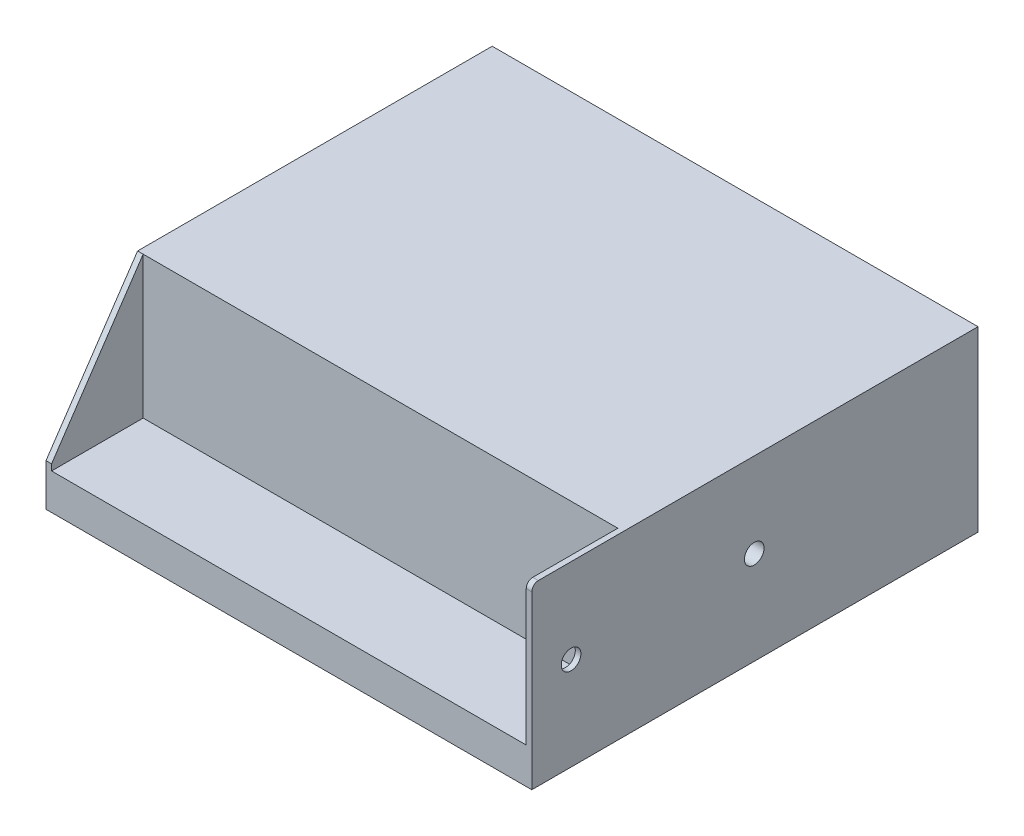
ISO-10303-21;
HEADER;
FILE_DESCRIPTION(('STEP AP214'),'2;1');
FILE_NAME('part.step','',(''),(''),'','','');
FILE_SCHEMA(('AUTOMOTIVE_DESIGN { 1 0 10303 214 1 1 1 1 }'));
ENDSEC;
DATA;
#1=APPLICATION_CONTEXT('core data for automotive mechanical design processes');
#2=APPLICATION_PROTOCOL_DEFINITION('international standard','automotive_design',2000,#1);
#3=PRODUCT_CONTEXT('',#1,'mechanical');
#4=PRODUCT('Part','Part','',(#3));
#5=PRODUCT_RELATED_PRODUCT_CATEGORY('part','',(#4));
#6=PRODUCT_DEFINITION_FORMATION('','',#4);
#7=PRODUCT_DEFINITION_CONTEXT('part definition',#1,'design');
#8=PRODUCT_DEFINITION('design','',#6,#7);
#9=PRODUCT_DEFINITION_SHAPE('','',#8);
#10=(LENGTH_UNIT() NAMED_UNIT(*) SI_UNIT(.MILLI.,.METRE.));
#11=(NAMED_UNIT(*) PLANE_ANGLE_UNIT() SI_UNIT($,.RADIAN.));
#12=(NAMED_UNIT(*) SI_UNIT($,.STERADIAN.) SOLID_ANGLE_UNIT());
#13=UNCERTAINTY_MEASURE_WITH_UNIT(LENGTH_MEASURE(1.E-05),#10,'distance_accuracy_value','');
#14=(GEOMETRIC_REPRESENTATION_CONTEXT(3) GLOBAL_UNCERTAINTY_ASSIGNED_CONTEXT((#13)) GLOBAL_UNIT_ASSIGNED_CONTEXT((#10,
#11,#12)) REPRESENTATION_CONTEXT('',''));
#15=CARTESIAN_POINT('',(0.,0.,0.));
#16=DIRECTION('',(0.,0.,1.));
#17=DIRECTION('',(1.,0.,0.));
#18=AXIS2_PLACEMENT_3D('',#15,#16,#17);
#19=CARTESIAN_POINT('',(-37.125,27.2,34.1));
#20=DIRECTION('',(1.,0.,0.));
#21=DIRECTION('',(0.,0.,-1.));
#22=AXIS2_PLACEMENT_3D('',#19,#20,#21);
#23=PLANE('',#22);
#24=DIRECTION('',(0.,-1.,0.));
#25=VECTOR('',#24,1.);
#26=CARTESIAN_POINT('',(-37.125,27.2,34.1));
#27=LINE('',#26,#25);
#28=CARTESIAN_POINT('',(-37.125,6.44414644082164,34.1));
#29=VERTEX_POINT('',#28);
#30=CARTESIAN_POINT('',(-37.125,0.,34.1));
#31=VERTEX_POINT('',#30);
#32=EDGE_CURVE('E134',#29,#31,#27,.T.);
#33=ORIENTED_EDGE('',*,*,#32,.F.);
#34=DIRECTION('',(0.,0.829037572555041,-0.559192903470748));
#35=VECTOR('',#34,1.);
#36=CARTESIAN_POINT('',(-37.125,27.2,20.1));
#37=LINE('',#36,#35);
#38=CARTESIAN_POINT('',(-37.125,27.2,20.1));
#39=VERTEX_POINT('',#38);
#40=EDGE_CURVE('E198',#29,#39,#37,.T.);
#41=ORIENTED_EDGE('',*,*,#40,.T.);
#42=DIRECTION('',(0.,0.,1.));
#43=VECTOR('',#42,1.);
#44=CARTESIAN_POINT('',(-37.125,27.2,34.1));
#45=LINE('',#44,#43);
#46=CARTESIAN_POINT('',(-37.125,27.2,-34.1));
#47=VERTEX_POINT('',#46);
#48=EDGE_CURVE('E133',#47,#39,#45,.T.);
#49=ORIENTED_EDGE('',*,*,#48,.F.);
#50=DIRECTION('',(0.,-1.,0.));
#51=VECTOR('',#50,1.);
#52=CARTESIAN_POINT('',(-37.125,27.2,-34.1));
#53=LINE('',#52,#51);
#54=CARTESIAN_POINT('',(-37.125,0.,-34.1));
#55=VERTEX_POINT('',#54);
#56=EDGE_CURVE('E178',#47,#55,#53,.T.);
#57=ORIENTED_EDGE('',*,*,#56,.T.);
#58=DIRECTION('',(0.,0.,1.));
#59=VECTOR('',#58,1.);
#60=CARTESIAN_POINT('',(-37.125,0.,34.1));
#61=LINE('',#60,#59);
#62=EDGE_CURVE('E165',#55,#31,#61,.T.);
#63=ORIENTED_EDGE('',*,*,#62,.T.);
#64=EDGE_LOOP('',(#33,#41,#49,#57,#63));
#65=FACE_BOUND('',#64,.T.);
#66=ADVANCED_FACE('F41',(#65),#23,.F.);
#67=CARTESIAN_POINT('',(37.125,27.2,34.1));
#68=DIRECTION('',(0.,0.,-1.));
#69=DIRECTION('',(-1.,0.,0.));
#70=AXIS2_PLACEMENT_3D('',#67,#68,#69);
#71=PLANE('',#70);
#72=DIRECTION('',(0.,-1.,0.));
#73=VECTOR('',#72,1.);
#74=CARTESIAN_POINT('',(37.125,27.2,34.1));
#75=LINE('',#74,#73);
#76=CARTESIAN_POINT('',(37.125,26.2,34.1));
#77=VERTEX_POINT('',#76);
#78=CARTESIAN_POINT('',(37.125,0.,34.1));
#79=VERTEX_POINT('',#78);
#80=EDGE_CURVE('E192',#77,#79,#75,.T.);
#81=ORIENTED_EDGE('',*,*,#80,.F.);
#82=DIRECTION('',(1.,0.,0.));
#83=VECTOR('',#82,1.);
#84=CARTESIAN_POINT('',(36.275,26.2,34.1));
#85=LINE('',#84,#83);
#86=CARTESIAN_POINT('',(36.275,26.2,34.1));
#87=VERTEX_POINT('',#86);
#88=EDGE_CURVE('E49',#77,#87,#85,.F.);
#89=ORIENTED_EDGE('',*,*,#88,.T.);
#90=DIRECTION('',(0.,1.,0.));
#91=VECTOR('',#90,1.);
#92=CARTESIAN_POINT('',(36.275,-73.8884463228183,34.1));
#93=LINE('',#92,#91);
#94=CARTESIAN_POINT('',(36.275,5.50000000000001,34.1));
#95=VERTEX_POINT('',#94);
#96=EDGE_CURVE('E155',#95,#87,#93,.T.);
#97=ORIENTED_EDGE('',*,*,#96,.F.);
#98=DIRECTION('',(-1.,0.,0.));
#99=VECTOR('',#98,1.);
#100=CARTESIAN_POINT('',(36.275,5.50000000000001,34.1));
#101=LINE('',#100,#99);
#102=CARTESIAN_POINT('',(-36.275,5.50000000000001,34.1));
#103=VERTEX_POINT('',#102);
#104=EDGE_CURVE('E453',#95,#103,#101,.T.);
#105=ORIENTED_EDGE('',*,*,#104,.T.);
#106=DIRECTION('',(0.,1.,0.));
#107=VECTOR('',#106,1.);
#108=CARTESIAN_POINT('',(-36.275,-73.8884463228183,34.1));
#109=LINE('',#108,#107);
#110=CARTESIAN_POINT('',(-36.275,6.44414644082164,34.1));
#111=VERTEX_POINT('',#110);
#112=EDGE_CURVE('E142',#103,#111,#109,.T.);
#113=ORIENTED_EDGE('',*,*,#112,.T.);
#114=DIRECTION('',(-1.,0.,0.));
#115=VECTOR('',#114,1.);
#116=CARTESIAN_POINT('',(-37.125,6.44414644082164,34.1));
#117=LINE('',#116,#115);
#118=EDGE_CURVE('E119',#111,#29,#117,.T.);
#119=ORIENTED_EDGE('',*,*,#118,.T.);
#120=ORIENTED_EDGE('',*,*,#32,.T.);
#121=DIRECTION('',(1.,0.,0.));
#122=VECTOR('',#121,1.);
#123=CARTESIAN_POINT('',(37.125,0.,34.1));
#124=LINE('',#123,#122);
#125=EDGE_CURVE('E181',#31,#79,#124,.T.);
#126=ORIENTED_EDGE('',*,*,#125,.T.);
#127=EDGE_LOOP('',(#81,#89,#97,#105,#113,#119,#120,#126));
#128=FACE_BOUND('',#127,.T.);
#129=ADVANCED_FACE('F218',(#128),#71,.F.);
#130=CARTESIAN_POINT('',(37.125,27.2,34.1));
#131=DIRECTION('',(-1.,0.,0.));
#132=DIRECTION('',(0.,0.,1.));
#133=AXIS2_PLACEMENT_3D('',#130,#131,#132);
#134=PLANE('',#133);
#135=CARTESIAN_POINT('',(37.125,14.25,28.1));
#136=DIRECTION('',(1.,0.,0.));
#137=DIRECTION('',(0.,0.,-1.));
#138=AXIS2_PLACEMENT_3D('',#135,#136,#137);
#139=CIRCLE('',#138,1.5);
#140=CARTESIAN_POINT('',(37.125,14.25,26.6));
#141=VERTEX_POINT('',#140);
#142=EDGE_CURVE('E162',#141,#141,#139,.T.);
#143=ORIENTED_EDGE('',*,*,#142,.F.);
#144=EDGE_LOOP('',(#143));
#145=FACE_BOUND('',#144,.T.);
#146=CARTESIAN_POINT('',(37.125,14.25,0.099999999999989));
#147=DIRECTION('',(1.,0.,0.));
#148=DIRECTION('',(0.,0.,-1.));
#149=AXIS2_PLACEMENT_3D('',#146,#147,#148);
#150=CIRCLE('',#149,1.5);
#151=CARTESIAN_POINT('',(37.125,14.25,-1.40000000000001));
#152=VERTEX_POINT('',#151);
#153=EDGE_CURVE('E166',#152,#152,#150,.T.);
#154=ORIENTED_EDGE('',*,*,#153,.F.);
#155=EDGE_LOOP('',(#154));
#156=FACE_BOUND('',#155,.T.);
#157=DIRECTION('',(0.,0.,-1.));
#158=VECTOR('',#157,1.);
#159=CARTESIAN_POINT('',(37.125,27.2,34.1));
#160=LINE('',#159,#158);
#161=CARTESIAN_POINT('',(37.125,27.2,33.1));
#162=VERTEX_POINT('',#161);
#163=CARTESIAN_POINT('',(37.125,27.2,-34.1));
#164=VERTEX_POINT('',#163);
#165=EDGE_CURVE('E173',#162,#164,#160,.T.);
#166=ORIENTED_EDGE('',*,*,#165,.F.);
#167=CARTESIAN_POINT('',(37.125,26.2,33.1));
#168=DIRECTION('',(-1.,0.,0.));
#169=DIRECTION('',(0.,0.,1.));
#170=AXIS2_PLACEMENT_3D('',#167,#168,#169);
#171=CIRCLE('',#170,1.);
#172=EDGE_CURVE('E63',#162,#77,#171,.F.);
#173=ORIENTED_EDGE('',*,*,#172,.T.);
#174=ORIENTED_EDGE('',*,*,#80,.T.);
#175=DIRECTION('',(0.,0.,-1.));
#176=VECTOR('',#175,1.);
#177=CARTESIAN_POINT('',(37.125,0.,34.1));
#178=LINE('',#177,#176);
#179=CARTESIAN_POINT('',(37.125,0.,-34.1));
#180=VERTEX_POINT('',#179);
#181=EDGE_CURVE('E184',#79,#180,#178,.T.);
#182=ORIENTED_EDGE('',*,*,#181,.T.);
#183=DIRECTION('',(0.,-1.,0.));
#184=VECTOR('',#183,1.);
#185=CARTESIAN_POINT('',(37.125,27.2,-34.1));
#186=LINE('',#185,#184);
#187=EDGE_CURVE('E189',#164,#180,#186,.T.);
#188=ORIENTED_EDGE('',*,*,#187,.F.);
#189=EDGE_LOOP('',(#166,#173,#174,#182,#188));
#190=FACE_BOUND('',#189,.T.);
#191=ADVANCED_FACE('F207',(#145,#156,#190),#134,.F.);
#192=CARTESIAN_POINT('',(37.125,27.2,-34.1));
#193=DIRECTION('',(0.,0.,1.));
#194=DIRECTION('',(1.,0.,0.));
#195=AXIS2_PLACEMENT_3D('',#192,#193,#194);
#196=PLANE('',#195);
#197=DIRECTION('',(-1.,0.,0.));
#198=VECTOR('',#197,1.);
#199=CARTESIAN_POINT('',(37.125,0.,-34.1));
#200=LINE('',#199,#198);
#201=EDGE_CURVE('E174',#180,#55,#200,.T.);
#202=ORIENTED_EDGE('',*,*,#201,.T.);
#203=ORIENTED_EDGE('',*,*,#56,.F.);
#204=DIRECTION('',(-1.,0.,0.));
#205=VECTOR('',#204,1.);
#206=CARTESIAN_POINT('',(37.125,27.2,-34.1));
#207=LINE('',#206,#205);
#208=EDGE_CURVE('E176',#164,#47,#207,.T.);
#209=ORIENTED_EDGE('',*,*,#208,.F.);
#210=ORIENTED_EDGE('',*,*,#187,.T.);
#211=EDGE_LOOP('',(#202,#203,#209,#210));
#212=FACE_BOUND('',#211,.T.);
#213=ADVANCED_FACE('F213',(#212),#196,.F.);
#214=CARTESIAN_POINT('',(0.,27.2,0.));
#215=DIRECTION('',(0.,1.,0.));
#216=DIRECTION('',(0.,0.,1.));
#217=AXIS2_PLACEMENT_3D('',#214,#215,#216);
#218=PLANE('',#217);
#219=DIRECTION('',(0.,0.,-1.));
#220=VECTOR('',#219,1.);
#221=CARTESIAN_POINT('',(36.275,27.2,34.1));
#222=LINE('',#221,#220);
#223=CARTESIAN_POINT('',(36.275,27.2,33.1));
#224=VERTEX_POINT('',#223);
#225=CARTESIAN_POINT('',(36.275,27.2,20.1));
#226=VERTEX_POINT('',#225);
#227=EDGE_CURVE('E148',#224,#226,#222,.T.);
#228=ORIENTED_EDGE('',*,*,#227,.F.);
#229=DIRECTION('',(1.,0.,0.));
#230=VECTOR('',#229,1.);
#231=CARTESIAN_POINT('',(37.125,27.2,33.1));
#232=LINE('',#231,#230);
#233=EDGE_CURVE('E200',#224,#162,#232,.T.);
#234=ORIENTED_EDGE('',*,*,#233,.T.);
#235=ORIENTED_EDGE('',*,*,#165,.T.);
#236=ORIENTED_EDGE('',*,*,#208,.T.);
#237=ORIENTED_EDGE('',*,*,#48,.T.);
#238=DIRECTION('',(1.,0.,0.));
#239=VECTOR('',#238,1.);
#240=CARTESIAN_POINT('',(-36.275,27.2,20.1));
#241=LINE('',#240,#239);
#242=CARTESIAN_POINT('',(-36.275,27.2,20.1));
#243=VERTEX_POINT('',#242);
#244=EDGE_CURVE('E118',#39,#243,#241,.T.);
#245=ORIENTED_EDGE('',*,*,#244,.T.);
#246=DIRECTION('',(-1.,0.,0.));
#247=VECTOR('',#246,1.);
#248=CARTESIAN_POINT('',(36.275,27.2,20.1));
#249=LINE('',#248,#247);
#250=EDGE_CURVE('E131',#226,#243,#249,.T.);
#251=ORIENTED_EDGE('',*,*,#250,.F.);
#252=EDGE_LOOP('',(#228,#234,#235,#236,#237,#245,#251));
#253=FACE_BOUND('',#252,.T.);
#254=ADVANCED_FACE('F129',(#253),#218,.T.);
#255=CARTESIAN_POINT('',(0.,0.,0.));
#256=DIRECTION('',(0.,1.,0.));
#257=DIRECTION('',(0.,0.,1.));
#258=AXIS2_PLACEMENT_3D('',#255,#256,#257);
#259=PLANE('',#258);
#260=CARTESIAN_POINT('',(0.,0.,-30.1));
#261=DIRECTION('',(0.,-1.,0.));
#262=DIRECTION('',(0.,0.,-1.));
#263=AXIS2_PLACEMENT_3D('',#260,#261,#262);
#264=CIRCLE('',#263,1.5);
#265=CARTESIAN_POINT('',(0.,0.,-31.6));
#266=VERTEX_POINT('',#265);
#267=EDGE_CURVE('E441',#266,#266,#264,.T.);
#268=ORIENTED_EDGE('',*,*,#267,.F.);
#269=EDGE_LOOP('',(#268));
#270=FACE_BOUND('',#269,.T.);
#271=CARTESIAN_POINT('',(0.,0.,19.9));
#272=DIRECTION('',(0.,-1.,0.));
#273=DIRECTION('',(0.,0.,-1.));
#274=AXIS2_PLACEMENT_3D('',#271,#272,#273);
#275=CIRCLE('',#274,1.5);
#276=CARTESIAN_POINT('',(0.,0.,18.4));
#277=VERTEX_POINT('',#276);
#278=EDGE_CURVE('E444',#277,#277,#275,.T.);
#279=ORIENTED_EDGE('',*,*,#278,.F.);
#280=EDGE_LOOP('',(#279));
#281=FACE_BOUND('',#280,.T.);
#282=ORIENTED_EDGE('',*,*,#62,.F.);
#283=ORIENTED_EDGE('',*,*,#201,.F.);
#284=ORIENTED_EDGE('',*,*,#181,.F.);
#285=ORIENTED_EDGE('',*,*,#125,.F.);
#286=EDGE_LOOP('',(#282,#283,#284,#285));
#287=FACE_BOUND('',#286,.T.);
#288=ADVANCED_FACE('F220',(#270,#281,#287),#259,.F.);
#289=CARTESIAN_POINT('',(27.125,14.25,0.099999999999989));
#290=DIRECTION('',(1.,0.,0.));
#291=DIRECTION('',(0.,0.,-1.));
#292=AXIS2_PLACEMENT_3D('',#289,#290,#291);
#293=CYLINDRICAL_SURFACE('',#292,1.5);
#294=CARTESIAN_POINT('',(27.125,14.25,0.099999999999989));
#295=DIRECTION('',(1.,0.,0.));
#296=DIRECTION('',(0.,0.,-1.));
#297=AXIS2_PLACEMENT_3D('',#294,#295,#296);
#298=CIRCLE('',#297,1.5);
#299=CARTESIAN_POINT('',(27.125,14.25,-1.40000000000001));
#300=VERTEX_POINT('',#299);
#301=EDGE_CURVE('E169',#300,#300,#298,.T.);
#302=ORIENTED_EDGE('',*,*,#301,.F.);
#303=EDGE_LOOP('',(#302));
#304=FACE_BOUND('',#303,.T.);
#305=ORIENTED_EDGE('',*,*,#153,.T.);
#306=EDGE_LOOP('',(#305));
#307=FACE_BOUND('',#306,.T.);
#308=ADVANCED_FACE('F222',(#304,#307),#293,.F.);
#309=CARTESIAN_POINT('',(27.125,14.25,0.099999999999989));
#310=DIRECTION('',(1.,0.,0.));
#311=DIRECTION('',(0.,0.,-1.));
#312=AXIS2_PLACEMENT_3D('',#309,#310,#311);
#313=PLANE('',#312);
#314=ORIENTED_EDGE('',*,*,#301,.T.);
#315=EDGE_LOOP('',(#314));
#316=FACE_BOUND('',#315,.T.);
#317=ADVANCED_FACE('F230',(#316),#313,.T.);
#318=CARTESIAN_POINT('',(27.125,14.25,28.1));
#319=DIRECTION('',(1.,0.,0.));
#320=DIRECTION('',(0.,0.,-1.));
#321=AXIS2_PLACEMENT_3D('',#318,#319,#320);
#322=CYLINDRICAL_SURFACE('',#321,1.5);
#323=CARTESIAN_POINT('',(36.275,14.25,28.1));
#324=DIRECTION('',(1.,0.,0.));
#325=DIRECTION('',(0.,0.,-1.));
#326=AXIS2_PLACEMENT_3D('',#323,#324,#325);
#327=CIRCLE('',#326,1.5);
#328=CARTESIAN_POINT('',(36.275,14.25,26.6));
#329=VERTEX_POINT('',#328);
#330=EDGE_CURVE('E160',#329,#329,#327,.F.);
#331=ORIENTED_EDGE('',*,*,#330,.T.);
#332=EDGE_LOOP('',(#331));
#333=FACE_BOUND('',#332,.T.);
#334=ORIENTED_EDGE('',*,*,#142,.T.);
#335=EDGE_LOOP('',(#334));
#336=FACE_BOUND('',#335,.T.);
#337=ADVANCED_FACE('F271',(#333,#336),#322,.F.);
#338=CARTESIAN_POINT('',(36.275,-73.8884463228183,34.1));
#339=DIRECTION('',(1.,0.,0.));
#340=DIRECTION('',(0.,0.,-1.));
#341=AXIS2_PLACEMENT_3D('',#338,#339,#340);
#342=PLANE('',#341);
#343=ORIENTED_EDGE('',*,*,#96,.T.);
#344=CARTESIAN_POINT('',(36.275,26.2,33.1));
#345=DIRECTION('',(1.,0.,0.));
#346=DIRECTION('',(0.,0.,-1.));
#347=AXIS2_PLACEMENT_3D('',#344,#345,#346);
#348=CIRCLE('',#347,1.);
#349=EDGE_CURVE('E12',#87,#224,#348,.F.);
#350=ORIENTED_EDGE('',*,*,#349,.T.);
#351=ORIENTED_EDGE('',*,*,#227,.T.);
#352=DIRECTION('',(0.,1.,0.));
#353=VECTOR('',#352,1.);
#354=CARTESIAN_POINT('',(36.275,-73.8884463228183,20.1));
#355=LINE('',#354,#353);
#356=CARTESIAN_POINT('',(36.275,5.50000000000001,20.1));
#357=VERTEX_POINT('',#356);
#358=EDGE_CURVE('E143',#357,#226,#355,.T.);
#359=ORIENTED_EDGE('',*,*,#358,.F.);
#360=DIRECTION('',(0.,0.,1.));
#361=VECTOR('',#360,1.);
#362=CARTESIAN_POINT('',(36.275,5.50000000000001,34.1));
#363=LINE('',#362,#361);
#364=EDGE_CURVE('E161',#357,#95,#363,.T.);
#365=ORIENTED_EDGE('',*,*,#364,.T.);
#366=EDGE_LOOP('',(#343,#350,#351,#359,#365));
#367=FACE_BOUND('',#366,.T.);
#368=ORIENTED_EDGE('',*,*,#330,.F.);
#369=EDGE_LOOP('',(#368));
#370=FACE_BOUND('',#369,.T.);
#371=ADVANCED_FACE('F267',(#367,#370),#342,.F.);
#372=CARTESIAN_POINT('',(-36.275,-73.8884463228183,34.1));
#373=DIRECTION('',(-1.,0.,0.));
#374=DIRECTION('',(0.,0.,1.));
#375=AXIS2_PLACEMENT_3D('',#372,#373,#374);
#376=PLANE('',#375);
#377=DIRECTION('',(0.,1.,0.));
#378=VECTOR('',#377,1.);
#379=CARTESIAN_POINT('',(-36.275,-73.8884463228183,20.1));
#380=LINE('',#379,#378);
#381=CARTESIAN_POINT('',(-36.275,5.50000000000001,20.1));
#382=VERTEX_POINT('',#381);
#383=EDGE_CURVE('E137',#382,#243,#380,.T.);
#384=ORIENTED_EDGE('',*,*,#383,.T.);
#385=DIRECTION('',(0.,-0.829037572555041,0.559192903470748));
#386=VECTOR('',#385,1.);
#387=CARTESIAN_POINT('',(-36.275,27.2,20.1));
#388=LINE('',#387,#386);
#389=EDGE_CURVE('E114',#243,#111,#388,.T.);
#390=ORIENTED_EDGE('',*,*,#389,.T.);
#391=ORIENTED_EDGE('',*,*,#112,.F.);
#392=DIRECTION('',(0.,0.,-1.));
#393=VECTOR('',#392,1.);
#394=CARTESIAN_POINT('',(-36.275,5.50000000000001,34.1));
#395=LINE('',#394,#393);
#396=EDGE_CURVE('E139',#103,#382,#395,.T.);
#397=ORIENTED_EDGE('',*,*,#396,.T.);
#398=EDGE_LOOP('',(#384,#390,#391,#397));
#399=FACE_BOUND('',#398,.T.);
#400=ADVANCED_FACE('F138',(#399),#376,.F.);
#401=CARTESIAN_POINT('',(36.275,-73.8884463228183,20.1));
#402=DIRECTION('',(0.,0.,-1.));
#403=DIRECTION('',(-1.,0.,0.));
#404=AXIS2_PLACEMENT_3D('',#401,#402,#403);
#405=PLANE('',#404);
#406=DIRECTION('',(1.,0.,0.));
#407=VECTOR('',#406,1.);
#408=CARTESIAN_POINT('',(36.275,5.50000000000001,20.1));
#409=LINE('',#408,#407);
#410=EDGE_CURVE('E158',#382,#357,#409,.T.);
#411=ORIENTED_EDGE('',*,*,#410,.T.);
#412=ORIENTED_EDGE('',*,*,#358,.T.);
#413=ORIENTED_EDGE('',*,*,#250,.T.);
#414=ORIENTED_EDGE('',*,*,#383,.F.);
#415=EDGE_LOOP('',(#411,#412,#413,#414));
#416=FACE_BOUND('',#415,.T.);
#417=ADVANCED_FACE('F146',(#416),#405,.F.);
#418=CARTESIAN_POINT('',(0.,5.5,0.));
#419=DIRECTION('',(0.,1.,0.));
#420=DIRECTION('',(0.,0.,1.));
#421=AXIS2_PLACEMENT_3D('',#418,#419,#420);
#422=PLANE('',#421);
#423=ORIENTED_EDGE('',*,*,#364,.F.);
#424=ORIENTED_EDGE('',*,*,#410,.F.);
#425=ORIENTED_EDGE('',*,*,#396,.F.);
#426=ORIENTED_EDGE('',*,*,#104,.F.);
#427=EDGE_LOOP('',(#423,#424,#425,#426));
#428=FACE_BOUND('',#427,.T.);
#429=ADVANCED_FACE('F249',(#428),#422,.T.);
#430=CARTESIAN_POINT('',(0.,27.2,20.1));
#431=DIRECTION('',(0.,0.559192903470748,0.829037572555041));
#432=DIRECTION('',(-1.,0.,0.));
#433=AXIS2_PLACEMENT_3D('',#430,#431,#432);
#434=PLANE('',#433);
#435=ORIENTED_EDGE('',*,*,#40,.F.);
#436=ORIENTED_EDGE('',*,*,#118,.F.);
#437=ORIENTED_EDGE('',*,*,#389,.F.);
#438=ORIENTED_EDGE('',*,*,#244,.F.);
#439=EDGE_LOOP('',(#435,#436,#437,#438));
#440=FACE_BOUND('',#439,.T.);
#441=ADVANCED_FACE('F117',(#440),#434,.T.);
#442=CARTESIAN_POINT('',(0.,26.2,33.1));
#443=DIRECTION('',(-1.,0.,0.));
#444=DIRECTION('',(0.,0.,1.));
#445=AXIS2_PLACEMENT_3D('',#442,#443,#444);
#446=CYLINDRICAL_SURFACE('',#445,1.);
#447=ORIENTED_EDGE('',*,*,#349,.F.);
#448=ORIENTED_EDGE('',*,*,#88,.F.);
#449=ORIENTED_EDGE('',*,*,#172,.F.);
#450=ORIENTED_EDGE('',*,*,#233,.F.);
#451=EDGE_LOOP('',(#447,#448,#449,#450));
#452=FACE_BOUND('',#451,.T.);
#453=ADVANCED_FACE('F43',(#452),#446,.T.);
#454=CARTESIAN_POINT('',(0.,2.,19.9));
#455=DIRECTION('',(0.,-1.,0.));
#456=DIRECTION('',(0.,0.,-1.));
#457=AXIS2_PLACEMENT_3D('',#454,#455,#456);
#458=CYLINDRICAL_SURFACE('',#457,1.5);
#459=CARTESIAN_POINT('',(0.,2.,19.9));
#460=DIRECTION('',(0.,-1.,0.));
#461=DIRECTION('',(0.,0.,-1.));
#462=AXIS2_PLACEMENT_3D('',#459,#460,#461);
#463=CIRCLE('',#462,1.5);
#464=CARTESIAN_POINT('',(0.,2.,18.4));
#465=VERTEX_POINT('',#464);
#466=EDGE_CURVE('E449',#465,#465,#463,.T.);
#467=ORIENTED_EDGE('',*,*,#466,.F.);
#468=EDGE_LOOP('',(#467));
#469=FACE_BOUND('',#468,.T.);
#470=ORIENTED_EDGE('',*,*,#278,.T.);
#471=EDGE_LOOP('',(#470));
#472=FACE_BOUND('',#471,.T.);
#473=ADVANCED_FACE('F254',(#469,#472),#458,.F.);
#474=CARTESIAN_POINT('',(0.,2.,19.9));
#475=DIRECTION('',(0.,-1.,0.));
#476=DIRECTION('',(0.,0.,-1.));
#477=AXIS2_PLACEMENT_3D('',#474,#475,#476);
#478=PLANE('',#477);
#479=ORIENTED_EDGE('',*,*,#466,.T.);
#480=EDGE_LOOP('',(#479));
#481=FACE_BOUND('',#480,.T.);
#482=ADVANCED_FACE('F264',(#481),#478,.T.);
#483=CARTESIAN_POINT('',(0.,2.,-30.1));
#484=DIRECTION('',(0.,-1.,0.));
#485=DIRECTION('',(0.,0.,-1.));
#486=AXIS2_PLACEMENT_3D('',#483,#484,#485);
#487=CYLINDRICAL_SURFACE('',#486,1.5);
#488=CARTESIAN_POINT('',(0.,2.,-30.1));
#489=DIRECTION('',(0.,-1.,0.));
#490=DIRECTION('',(0.,0.,-1.));
#491=AXIS2_PLACEMENT_3D('',#488,#489,#490);
#492=CIRCLE('',#491,1.5);
#493=CARTESIAN_POINT('',(0.,2.,-31.6));
#494=VERTEX_POINT('',#493);
#495=EDGE_CURVE('E151',#494,#494,#492,.T.);
#496=ORIENTED_EDGE('',*,*,#495,.F.);
#497=EDGE_LOOP('',(#496));
#498=FACE_BOUND('',#497,.T.);
#499=ORIENTED_EDGE('',*,*,#267,.T.);
#500=EDGE_LOOP('',(#499));
#501=FACE_BOUND('',#500,.T.);
#502=ADVANCED_FACE('F404',(#498,#501),#487,.F.);
#503=CARTESIAN_POINT('',(0.,2.,-30.1));
#504=DIRECTION('',(0.,-1.,0.));
#505=DIRECTION('',(0.,0.,-1.));
#506=AXIS2_PLACEMENT_3D('',#503,#504,#505);
#507=PLANE('',#506);
#508=ORIENTED_EDGE('',*,*,#495,.T.);
#509=EDGE_LOOP('',(#508));
#510=FACE_BOUND('',#509,.T.);
#511=ADVANCED_FACE('F413',(#510),#507,.T.);
#512=CLOSED_SHELL('',(#66,#129,#191,#213,#254,#288,#308,#317,#337,#371,#400,#417,#429,#441,#453,
#473,#482,#502,#511));
#513=MANIFOLD_SOLID_BREP('B2',#512);
#514=ADVANCED_BREP_SHAPE_REPRESENTATION('',(#18,#513),#14);
#515=SHAPE_DEFINITION_REPRESENTATION(#9,#514);
ENDSEC;
END-ISO-10303-21;
